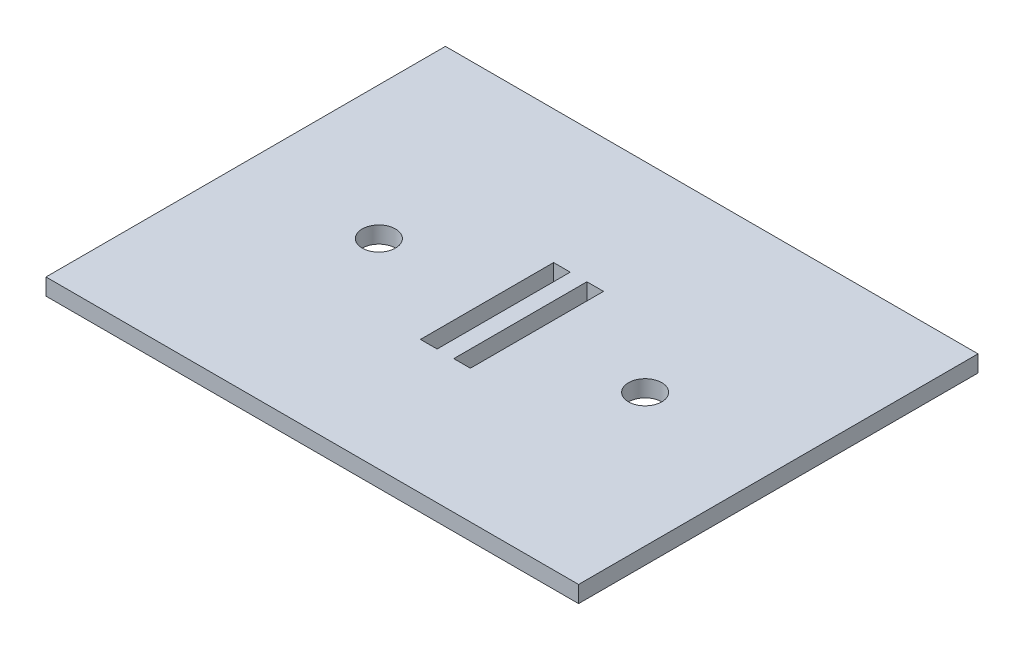
ISO-10303-21;
HEADER;
FILE_DESCRIPTION(('STEP AP214'),'2;1');
FILE_NAME('part.step','',(''),(''),'','','');
FILE_SCHEMA(('AUTOMOTIVE_DESIGN { 1 0 10303 214 1 1 1 1 }'));
ENDSEC;
DATA;
#1=APPLICATION_CONTEXT('core data for automotive mechanical design processes');
#2=APPLICATION_PROTOCOL_DEFINITION('international standard','automotive_design',2000,#1);
#3=PRODUCT_CONTEXT('',#1,'mechanical');
#4=PRODUCT('Part','Part','',(#3));
#5=PRODUCT_RELATED_PRODUCT_CATEGORY('part','',(#4));
#6=PRODUCT_DEFINITION_FORMATION('','',#4);
#7=PRODUCT_DEFINITION_CONTEXT('part definition',#1,'design');
#8=PRODUCT_DEFINITION('design','',#6,#7);
#9=PRODUCT_DEFINITION_SHAPE('','',#8);
#10=(LENGTH_UNIT() NAMED_UNIT(*) SI_UNIT(.MILLI.,.METRE.));
#11=(NAMED_UNIT(*) PLANE_ANGLE_UNIT() SI_UNIT($,.RADIAN.));
#12=(NAMED_UNIT(*) SI_UNIT($,.STERADIAN.) SOLID_ANGLE_UNIT());
#13=UNCERTAINTY_MEASURE_WITH_UNIT(LENGTH_MEASURE(1.E-05),#10,'distance_accuracy_value','');
#14=(GEOMETRIC_REPRESENTATION_CONTEXT(3) GLOBAL_UNCERTAINTY_ASSIGNED_CONTEXT((#13)) GLOBAL_UNIT_ASSIGNED_CONTEXT((#10,
#11,#12)) REPRESENTATION_CONTEXT('',''));
#15=CARTESIAN_POINT('',(0.,0.,0.));
#16=DIRECTION('',(0.,0.,1.));
#17=DIRECTION('',(1.,0.,0.));
#18=AXIS2_PLACEMENT_3D('',#15,#16,#17);
#19=CARTESIAN_POINT('',(-4.7625,3.175,0.));
#20=DIRECTION('',(1.,0.,0.));
#21=DIRECTION('',(0.,0.,-1.));
#22=AXIS2_PLACEMENT_3D('',#19,#20,#21);
#23=PLANE('',#22);
#24=DIRECTION('',(0.,0.,1.));
#25=VECTOR('',#24,1.);
#26=CARTESIAN_POINT('',(-4.7625,0.,0.));
#27=LINE('',#26,#25);
#28=CARTESIAN_POINT('',(-4.7625,0.,-12.7));
#29=VERTEX_POINT('',#28);
#30=CARTESIAN_POINT('',(-4.7625,0.,12.7));
#31=VERTEX_POINT('',#30);
#32=EDGE_CURVE('E211',#29,#31,#27,.T.);
#33=ORIENTED_EDGE('',*,*,#32,.F.);
#34=DIRECTION('',(0.,-1.,0.));
#35=VECTOR('',#34,1.);
#36=CARTESIAN_POINT('',(-4.7625,3.175,-12.7));
#37=LINE('',#36,#35);
#38=CARTESIAN_POINT('',(-4.7625,3.175,-12.7));
#39=VERTEX_POINT('',#38);
#40=EDGE_CURVE('E11',#39,#29,#37,.T.);
#41=ORIENTED_EDGE('',*,*,#40,.F.);
#42=DIRECTION('',(0.,0.,1.));
#43=VECTOR('',#42,1.);
#44=CARTESIAN_POINT('',(-4.7625,3.175,0.));
#45=LINE('',#44,#43);
#46=CARTESIAN_POINT('',(-4.7625,3.175,12.7));
#47=VERTEX_POINT('',#46);
#48=EDGE_CURVE('E161',#39,#47,#45,.T.);
#49=ORIENTED_EDGE('',*,*,#48,.T.);
#50=DIRECTION('',(0.,-1.,0.));
#51=VECTOR('',#50,1.);
#52=CARTESIAN_POINT('',(-4.7625,3.175,12.7));
#53=LINE('',#52,#51);
#54=EDGE_CURVE('E111',#47,#31,#53,.T.);
#55=ORIENTED_EDGE('',*,*,#54,.T.);
#56=EDGE_LOOP('',(#33,#41,#49,#55));
#57=FACE_BOUND('',#56,.T.);
#58=ADVANCED_FACE('F45',(#57),#23,.T.);
#59=CARTESIAN_POINT('',(0.,3.175,-12.7));
#60=DIRECTION('',(0.,0.,1.));
#61=DIRECTION('',(1.,0.,0.));
#62=AXIS2_PLACEMENT_3D('',#59,#60,#61);
#63=PLANE('',#62);
#64=DIRECTION('',(-1.,0.,0.));
#65=VECTOR('',#64,1.);
#66=CARTESIAN_POINT('',(0.,0.,-12.7));
#67=LINE('',#66,#65);
#68=CARTESIAN_POINT('',(-1.5875,0.,-12.7));
#69=VERTEX_POINT('',#68);
#70=EDGE_CURVE('E151',#69,#29,#67,.T.);
#71=ORIENTED_EDGE('',*,*,#70,.F.);
#72=DIRECTION('',(0.,-1.,0.));
#73=VECTOR('',#72,1.);
#74=CARTESIAN_POINT('',(-1.5875,3.175,-12.7));
#75=LINE('',#74,#73);
#76=CARTESIAN_POINT('',(-1.5875,3.175,-12.7));
#77=VERTEX_POINT('',#76);
#78=EDGE_CURVE('E56',#77,#69,#75,.T.);
#79=ORIENTED_EDGE('',*,*,#78,.F.);
#80=DIRECTION('',(-1.,0.,0.));
#81=VECTOR('',#80,1.);
#82=CARTESIAN_POINT('',(0.,3.175,-12.7));
#83=LINE('',#82,#81);
#84=EDGE_CURVE('E149',#77,#39,#83,.T.);
#85=ORIENTED_EDGE('',*,*,#84,.T.);
#86=ORIENTED_EDGE('',*,*,#40,.T.);
#87=EDGE_LOOP('',(#71,#79,#85,#86));
#88=FACE_BOUND('',#87,.T.);
#89=ADVANCED_FACE('F148',(#88),#63,.T.);
#90=CARTESIAN_POINT('',(-1.5875,3.175,0.));
#91=DIRECTION('',(-1.,0.,0.));
#92=DIRECTION('',(0.,0.,1.));
#93=AXIS2_PLACEMENT_3D('',#90,#91,#92);
#94=PLANE('',#93);
#95=DIRECTION('',(0.,0.,-1.));
#96=VECTOR('',#95,1.);
#97=CARTESIAN_POINT('',(-1.5875,0.,0.));
#98=LINE('',#97,#96);
#99=CARTESIAN_POINT('',(-1.5875,0.,12.7));
#100=VERTEX_POINT('',#99);
#101=EDGE_CURVE('E217',#100,#69,#98,.T.);
#102=ORIENTED_EDGE('',*,*,#101,.F.);
#103=DIRECTION('',(0.,-1.,0.));
#104=VECTOR('',#103,1.);
#105=CARTESIAN_POINT('',(-1.5875,3.175,12.7));
#106=LINE('',#105,#104);
#107=CARTESIAN_POINT('',(-1.5875,3.175,12.7));
#108=VERTEX_POINT('',#107);
#109=EDGE_CURVE('E104',#108,#100,#106,.T.);
#110=ORIENTED_EDGE('',*,*,#109,.F.);
#111=DIRECTION('',(0.,0.,-1.));
#112=VECTOR('',#111,1.);
#113=CARTESIAN_POINT('',(-1.5875,3.175,0.));
#114=LINE('',#113,#112);
#115=EDGE_CURVE('E160',#108,#77,#114,.T.);
#116=ORIENTED_EDGE('',*,*,#115,.T.);
#117=ORIENTED_EDGE('',*,*,#78,.T.);
#118=EDGE_LOOP('',(#102,#110,#116,#117));
#119=FACE_BOUND('',#118,.T.);
#120=ADVANCED_FACE('F164',(#119),#94,.T.);
#121=CARTESIAN_POINT('',(0.,3.175,38.1));
#122=DIRECTION('',(0.,0.,-1.));
#123=DIRECTION('',(-1.,0.,0.));
#124=AXIS2_PLACEMENT_3D('',#121,#122,#123);
#125=PLANE('',#124);
#126=DIRECTION('',(1.,0.,0.));
#127=VECTOR('',#126,1.);
#128=CARTESIAN_POINT('',(0.,0.,38.1));
#129=LINE('',#128,#127);
#130=CARTESIAN_POINT('',(-50.8,0.,38.1));
#131=VERTEX_POINT('',#130);
#132=CARTESIAN_POINT('',(50.8,0.,38.1));
#133=VERTEX_POINT('',#132);
#134=EDGE_CURVE('E195',#131,#133,#129,.T.);
#135=ORIENTED_EDGE('',*,*,#134,.T.);
#136=DIRECTION('',(0.,-1.,0.));
#137=VECTOR('',#136,1.);
#138=CARTESIAN_POINT('',(50.8,3.175,38.1));
#139=LINE('',#138,#137);
#140=CARTESIAN_POINT('',(50.8,3.175,38.1));
#141=VERTEX_POINT('',#140);
#142=EDGE_CURVE('E234',#141,#133,#139,.T.);
#143=ORIENTED_EDGE('',*,*,#142,.F.);
#144=DIRECTION('',(1.,0.,0.));
#145=VECTOR('',#144,1.);
#146=CARTESIAN_POINT('',(0.,3.175,38.1));
#147=LINE('',#146,#145);
#148=CARTESIAN_POINT('',(-50.8,3.175,38.1));
#149=VERTEX_POINT('',#148);
#150=EDGE_CURVE('E279',#149,#141,#147,.T.);
#151=ORIENTED_EDGE('',*,*,#150,.F.);
#152=DIRECTION('',(0.,-1.,0.));
#153=VECTOR('',#152,1.);
#154=CARTESIAN_POINT('',(-50.8,3.175,38.1));
#155=LINE('',#154,#153);
#156=EDGE_CURVE('E237',#149,#131,#155,.T.);
#157=ORIENTED_EDGE('',*,*,#156,.T.);
#158=EDGE_LOOP('',(#135,#143,#151,#157));
#159=FACE_BOUND('',#158,.T.);
#160=ADVANCED_FACE('F332',(#159),#125,.F.);
#161=CARTESIAN_POINT('',(50.8,3.175,0.));
#162=DIRECTION('',(-1.,0.,0.));
#163=DIRECTION('',(0.,0.,1.));
#164=AXIS2_PLACEMENT_3D('',#161,#162,#163);
#165=PLANE('',#164);
#166=DIRECTION('',(0.,0.,-1.));
#167=VECTOR('',#166,1.);
#168=CARTESIAN_POINT('',(50.8,0.,0.));
#169=LINE('',#168,#167);
#170=CARTESIAN_POINT('',(50.8,0.,-38.1));
#171=VERTEX_POINT('',#170);
#172=EDGE_CURVE('E199',#133,#171,#169,.T.);
#173=ORIENTED_EDGE('',*,*,#172,.T.);
#174=DIRECTION('',(0.,-1.,0.));
#175=VECTOR('',#174,1.);
#176=CARTESIAN_POINT('',(50.8,3.175,-38.1));
#177=LINE('',#176,#175);
#178=CARTESIAN_POINT('',(50.8,3.175,-38.1));
#179=VERTEX_POINT('',#178);
#180=EDGE_CURVE('E243',#179,#171,#177,.T.);
#181=ORIENTED_EDGE('',*,*,#180,.F.);
#182=DIRECTION('',(0.,0.,-1.));
#183=VECTOR('',#182,1.);
#184=CARTESIAN_POINT('',(50.8,3.175,0.));
#185=LINE('',#184,#183);
#186=EDGE_CURVE('E291',#141,#179,#185,.T.);
#187=ORIENTED_EDGE('',*,*,#186,.F.);
#188=ORIENTED_EDGE('',*,*,#142,.T.);
#189=EDGE_LOOP('',(#173,#181,#187,#188));
#190=FACE_BOUND('',#189,.T.);
#191=ADVANCED_FACE('F328',(#190),#165,.F.);
#192=CARTESIAN_POINT('',(0.,3.175,-38.1));
#193=DIRECTION('',(0.,0.,-1.));
#194=DIRECTION('',(-1.,0.,0.));
#195=AXIS2_PLACEMENT_3D('',#192,#193,#194);
#196=PLANE('',#195);
#197=DIRECTION('',(1.,0.,0.));
#198=VECTOR('',#197,1.);
#199=CARTESIAN_POINT('',(0.,0.,-38.1));
#200=LINE('',#199,#198);
#201=CARTESIAN_POINT('',(-50.8,0.,-38.1));
#202=VERTEX_POINT('',#201);
#203=EDGE_CURVE('E203',#202,#171,#200,.T.);
#204=ORIENTED_EDGE('',*,*,#203,.F.);
#205=DIRECTION('',(0.,-1.,0.));
#206=VECTOR('',#205,1.);
#207=CARTESIAN_POINT('',(-50.8,3.175,-38.1));
#208=LINE('',#207,#206);
#209=CARTESIAN_POINT('',(-50.8,3.175,-38.1));
#210=VERTEX_POINT('',#209);
#211=EDGE_CURVE('E240',#210,#202,#208,.T.);
#212=ORIENTED_EDGE('',*,*,#211,.F.);
#213=DIRECTION('',(1.,0.,0.));
#214=VECTOR('',#213,1.);
#215=CARTESIAN_POINT('',(0.,3.175,-38.1));
#216=LINE('',#215,#214);
#217=EDGE_CURVE('E294',#210,#179,#216,.T.);
#218=ORIENTED_EDGE('',*,*,#217,.T.);
#219=ORIENTED_EDGE('',*,*,#180,.T.);
#220=EDGE_LOOP('',(#204,#212,#218,#219));
#221=FACE_BOUND('',#220,.T.);
#222=ADVANCED_FACE('F325',(#221),#196,.T.);
#223=CARTESIAN_POINT('',(0.,3.175,-12.7));
#224=DIRECTION('',(0.,0.,-1.));
#225=DIRECTION('',(-1.,0.,0.));
#226=AXIS2_PLACEMENT_3D('',#223,#224,#225);
#227=PLANE('',#226);
#228=DIRECTION('',(1.,0.,0.));
#229=VECTOR('',#228,1.);
#230=CARTESIAN_POINT('',(0.,0.,-12.7));
#231=LINE('',#230,#229);
#232=CARTESIAN_POINT('',(1.5875,0.,-12.7));
#233=VERTEX_POINT('',#232);
#234=CARTESIAN_POINT('',(4.7625,0.,-12.7));
#235=VERTEX_POINT('',#234);
#236=EDGE_CURVE('E180',#233,#235,#231,.T.);
#237=ORIENTED_EDGE('',*,*,#236,.T.);
#238=DIRECTION('',(0.,-1.,0.));
#239=VECTOR('',#238,1.);
#240=CARTESIAN_POINT('',(4.7625,3.175,-12.7));
#241=LINE('',#240,#239);
#242=CARTESIAN_POINT('',(4.7625,3.175,-12.7));
#243=VERTEX_POINT('',#242);
#244=EDGE_CURVE('E49',#243,#235,#241,.T.);
#245=ORIENTED_EDGE('',*,*,#244,.F.);
#246=DIRECTION('',(1.,0.,0.));
#247=VECTOR('',#246,1.);
#248=CARTESIAN_POINT('',(0.,3.175,-12.7));
#249=LINE('',#248,#247);
#250=CARTESIAN_POINT('',(1.5875,3.175,-12.7));
#251=VERTEX_POINT('',#250);
#252=EDGE_CURVE('E231',#251,#243,#249,.T.);
#253=ORIENTED_EDGE('',*,*,#252,.F.);
#254=DIRECTION('',(0.,-1.,0.));
#255=VECTOR('',#254,1.);
#256=CARTESIAN_POINT('',(1.5875,3.175,-12.7));
#257=LINE('',#256,#255);
#258=EDGE_CURVE('E179',#251,#233,#257,.T.);
#259=ORIENTED_EDGE('',*,*,#258,.T.);
#260=EDGE_LOOP('',(#237,#245,#253,#259));
#261=FACE_BOUND('',#260,.T.);
#262=ADVANCED_FACE('F47',(#261),#227,.F.);
#263=CARTESIAN_POINT('',(4.7625,3.175,0.));
#264=DIRECTION('',(1.,0.,0.));
#265=DIRECTION('',(0.,0.,-1.));
#266=AXIS2_PLACEMENT_3D('',#263,#264,#265);
#267=PLANE('',#266);
#268=DIRECTION('',(0.,0.,1.));
#269=VECTOR('',#268,1.);
#270=CARTESIAN_POINT('',(4.7625,0.,0.));
#271=LINE('',#270,#269);
#272=CARTESIAN_POINT('',(4.7625,0.,12.7));
#273=VERTEX_POINT('',#272);
#274=EDGE_CURVE('E184',#235,#273,#271,.T.);
#275=ORIENTED_EDGE('',*,*,#274,.T.);
#276=DIRECTION('',(0.,-1.,0.));
#277=VECTOR('',#276,1.);
#278=CARTESIAN_POINT('',(4.7625,3.175,12.7));
#279=LINE('',#278,#277);
#280=CARTESIAN_POINT('',(4.7625,3.175,12.7));
#281=VERTEX_POINT('',#280);
#282=EDGE_CURVE('E254',#281,#273,#279,.T.);
#283=ORIENTED_EDGE('',*,*,#282,.F.);
#284=DIRECTION('',(0.,0.,1.));
#285=VECTOR('',#284,1.);
#286=CARTESIAN_POINT('',(4.7625,3.175,0.));
#287=LINE('',#286,#285);
#288=EDGE_CURVE('E119',#243,#281,#287,.T.);
#289=ORIENTED_EDGE('',*,*,#288,.F.);
#290=ORIENTED_EDGE('',*,*,#244,.T.);
#291=EDGE_LOOP('',(#275,#283,#289,#290));
#292=FACE_BOUND('',#291,.T.);
#293=ADVANCED_FACE('F261',(#292),#267,.F.);
#294=CARTESIAN_POINT('',(0.,3.175,12.7));
#295=DIRECTION('',(0.,0.,-1.));
#296=DIRECTION('',(-1.,0.,0.));
#297=AXIS2_PLACEMENT_3D('',#294,#295,#296);
#298=PLANE('',#297);
#299=DIRECTION('',(1.,0.,0.));
#300=VECTOR('',#299,1.);
#301=CARTESIAN_POINT('',(0.,0.,12.7));
#302=LINE('',#301,#300);
#303=CARTESIAN_POINT('',(1.5875,0.,12.7));
#304=VERTEX_POINT('',#303);
#305=EDGE_CURVE('E188',#304,#273,#302,.T.);
#306=ORIENTED_EDGE('',*,*,#305,.F.);
#307=DIRECTION('',(0.,-1.,0.));
#308=VECTOR('',#307,1.);
#309=CARTESIAN_POINT('',(1.5875,3.175,12.7));
#310=LINE('',#309,#308);
#311=CARTESIAN_POINT('',(1.5875,3.175,12.7));
#312=VERTEX_POINT('',#311);
#313=EDGE_CURVE('E252',#312,#304,#310,.T.);
#314=ORIENTED_EDGE('',*,*,#313,.F.);
#315=DIRECTION('',(1.,0.,0.));
#316=VECTOR('',#315,1.);
#317=CARTESIAN_POINT('',(0.,3.175,12.7));
#318=LINE('',#317,#316);
#319=EDGE_CURVE('E273',#312,#281,#318,.T.);
#320=ORIENTED_EDGE('',*,*,#319,.T.);
#321=ORIENTED_EDGE('',*,*,#282,.T.);
#322=EDGE_LOOP('',(#306,#314,#320,#321));
#323=FACE_BOUND('',#322,.T.);
#324=ADVANCED_FACE('F270',(#323),#298,.T.);
#325=CARTESIAN_POINT('',(25.4,3.175,0.));
#326=DIRECTION('',(0.,-1.,0.));
#327=DIRECTION('',(0.,0.,-1.));
#328=AXIS2_PLACEMENT_3D('',#325,#326,#327);
#329=CYLINDRICAL_SURFACE('',#328,3.175);
#330=CARTESIAN_POINT('',(25.4,3.175,0.));
#331=DIRECTION('',(0.,1.,0.));
#332=DIRECTION('',(0.,0.,1.));
#333=AXIS2_PLACEMENT_3D('',#330,#331,#332);
#334=CIRCLE('',#333,3.175);
#335=CARTESIAN_POINT('',(25.4,3.175,3.175));
#336=VERTEX_POINT('',#335);
#337=EDGE_CURVE('E168',#336,#336,#334,.T.);
#338=ORIENTED_EDGE('',*,*,#337,.T.);
#339=EDGE_LOOP('',(#338));
#340=FACE_BOUND('',#339,.T.);
#341=CARTESIAN_POINT('',(25.4,0.,0.));
#342=DIRECTION('',(0.,1.,0.));
#343=DIRECTION('',(0.,0.,1.));
#344=AXIS2_PLACEMENT_3D('',#341,#342,#343);
#345=CIRCLE('',#344,3.175);
#346=CARTESIAN_POINT('',(25.4,0.,3.175));
#347=VERTEX_POINT('',#346);
#348=EDGE_CURVE('E223',#347,#347,#345,.T.);
#349=ORIENTED_EDGE('',*,*,#348,.F.);
#350=EDGE_LOOP('',(#349));
#351=FACE_BOUND('',#350,.T.);
#352=ADVANCED_FACE('F307',(#340,#351),#329,.F.);
#353=CARTESIAN_POINT('',(0.,3.175,12.7));
#354=DIRECTION('',(0.,0.,1.));
#355=DIRECTION('',(1.,0.,0.));
#356=AXIS2_PLACEMENT_3D('',#353,#354,#355);
#357=PLANE('',#356);
#358=DIRECTION('',(-1.,0.,0.));
#359=VECTOR('',#358,1.);
#360=CARTESIAN_POINT('',(0.,0.,12.7));
#361=LINE('',#360,#359);
#362=EDGE_CURVE('E220',#100,#31,#361,.T.);
#363=ORIENTED_EDGE('',*,*,#362,.T.);
#364=ORIENTED_EDGE('',*,*,#54,.F.);
#365=DIRECTION('',(-1.,0.,0.));
#366=VECTOR('',#365,1.);
#367=CARTESIAN_POINT('',(0.,3.175,12.7));
#368=LINE('',#367,#366);
#369=EDGE_CURVE('E65',#108,#47,#368,.T.);
#370=ORIENTED_EDGE('',*,*,#369,.F.);
#371=ORIENTED_EDGE('',*,*,#109,.T.);
#372=EDGE_LOOP('',(#363,#364,#370,#371));
#373=FACE_BOUND('',#372,.T.);
#374=ADVANCED_FACE('F304',(#373),#357,.F.);
#375=CARTESIAN_POINT('',(-50.8,3.175,0.));
#376=DIRECTION('',(-1.,0.,0.));
#377=DIRECTION('',(0.,0.,1.));
#378=AXIS2_PLACEMENT_3D('',#375,#376,#377);
#379=PLANE('',#378);
#380=DIRECTION('',(0.,0.,-1.));
#381=VECTOR('',#380,1.);
#382=CARTESIAN_POINT('',(-50.8,0.,0.));
#383=LINE('',#382,#381);
#384=EDGE_CURVE('E207',#131,#202,#383,.T.);
#385=ORIENTED_EDGE('',*,*,#384,.F.);
#386=ORIENTED_EDGE('',*,*,#156,.F.);
#387=DIRECTION('',(0.,0.,-1.));
#388=VECTOR('',#387,1.);
#389=CARTESIAN_POINT('',(-50.8,3.175,0.));
#390=LINE('',#389,#388);
#391=EDGE_CURVE('E298',#149,#210,#390,.T.);
#392=ORIENTED_EDGE('',*,*,#391,.T.);
#393=ORIENTED_EDGE('',*,*,#211,.T.);
#394=EDGE_LOOP('',(#385,#386,#392,#393));
#395=FACE_BOUND('',#394,.T.);
#396=ADVANCED_FACE('F306',(#395),#379,.T.);
#397=CARTESIAN_POINT('',(1.5875,3.175,0.));
#398=DIRECTION('',(-1.,0.,0.));
#399=DIRECTION('',(0.,0.,1.));
#400=AXIS2_PLACEMENT_3D('',#397,#398,#399);
#401=PLANE('',#400);
#402=DIRECTION('',(0.,0.,-1.));
#403=VECTOR('',#402,1.);
#404=CARTESIAN_POINT('',(1.5875,0.,0.));
#405=LINE('',#404,#403);
#406=EDGE_CURVE('E192',#304,#233,#405,.T.);
#407=ORIENTED_EDGE('',*,*,#406,.T.);
#408=ORIENTED_EDGE('',*,*,#258,.F.);
#409=DIRECTION('',(0.,0.,-1.));
#410=VECTOR('',#409,1.);
#411=CARTESIAN_POINT('',(1.5875,3.175,0.));
#412=LINE('',#411,#410);
#413=EDGE_CURVE('E275',#312,#251,#412,.T.);
#414=ORIENTED_EDGE('',*,*,#413,.F.);
#415=ORIENTED_EDGE('',*,*,#313,.T.);
#416=EDGE_LOOP('',(#407,#408,#414,#415));
#417=FACE_BOUND('',#416,.T.);
#418=ADVANCED_FACE('F276',(#417),#401,.F.);
#419=CARTESIAN_POINT('',(-25.4,3.175,0.));
#420=DIRECTION('',(0.,-1.,0.));
#421=DIRECTION('',(0.,0.,-1.));
#422=AXIS2_PLACEMENT_3D('',#419,#420,#421);
#423=CYLINDRICAL_SURFACE('',#422,3.175);
#424=CARTESIAN_POINT('',(-25.4,3.175,0.));
#425=DIRECTION('',(0.,1.,0.));
#426=DIRECTION('',(0.,0.,1.));
#427=AXIS2_PLACEMENT_3D('',#424,#425,#426);
#428=CIRCLE('',#427,3.175);
#429=CARTESIAN_POINT('',(-25.4,3.175,3.175));
#430=VERTEX_POINT('',#429);
#431=EDGE_CURVE('E175',#430,#430,#428,.F.);
#432=ORIENTED_EDGE('',*,*,#431,.F.);
#433=EDGE_LOOP('',(#432));
#434=FACE_BOUND('',#433,.T.);
#435=CARTESIAN_POINT('',(-25.4,0.,0.));
#436=DIRECTION('',(0.,1.,0.));
#437=DIRECTION('',(0.,0.,1.));
#438=AXIS2_PLACEMENT_3D('',#435,#436,#437);
#439=CIRCLE('',#438,3.175);
#440=CARTESIAN_POINT('',(-25.4,0.,3.175));
#441=VERTEX_POINT('',#440);
#442=EDGE_CURVE('E227',#441,#441,#439,.F.);
#443=ORIENTED_EDGE('',*,*,#442,.T.);
#444=EDGE_LOOP('',(#443));
#445=FACE_BOUND('',#444,.T.);
#446=ADVANCED_FACE('F339',(#434,#445),#423,.F.);
#447=CARTESIAN_POINT('',(0.,3.175,0.));
#448=DIRECTION('',(0.,1.,0.));
#449=DIRECTION('',(0.,0.,1.));
#450=AXIS2_PLACEMENT_3D('',#447,#448,#449);
#451=PLANE('',#450);
#452=ORIENTED_EDGE('',*,*,#252,.T.);
#453=ORIENTED_EDGE('',*,*,#288,.T.);
#454=ORIENTED_EDGE('',*,*,#319,.F.);
#455=ORIENTED_EDGE('',*,*,#413,.T.);
#456=EDGE_LOOP('',(#452,#453,#454,#455));
#457=FACE_BOUND('',#456,.T.);
#458=ORIENTED_EDGE('',*,*,#150,.T.);
#459=ORIENTED_EDGE('',*,*,#186,.T.);
#460=ORIENTED_EDGE('',*,*,#217,.F.);
#461=ORIENTED_EDGE('',*,*,#391,.F.);
#462=EDGE_LOOP('',(#458,#459,#460,#461));
#463=FACE_BOUND('',#462,.T.);
#464=ORIENTED_EDGE('',*,*,#48,.F.);
#465=ORIENTED_EDGE('',*,*,#84,.F.);
#466=ORIENTED_EDGE('',*,*,#115,.F.);
#467=ORIENTED_EDGE('',*,*,#369,.T.);
#468=EDGE_LOOP('',(#464,#465,#466,#467));
#469=FACE_BOUND('',#468,.T.);
#470=ORIENTED_EDGE('',*,*,#337,.F.);
#471=EDGE_LOOP('',(#470));
#472=FACE_BOUND('',#471,.T.);
#473=ORIENTED_EDGE('',*,*,#431,.T.);
#474=EDGE_LOOP('',(#473));
#475=FACE_BOUND('',#474,.T.);
#476=ADVANCED_FACE('F158',(#457,#463,#469,#472,#475),#451,.T.);
#477=CARTESIAN_POINT('',(0.,0.,0.));
#478=DIRECTION('',(0.,1.,0.));
#479=DIRECTION('',(0.,0.,1.));
#480=AXIS2_PLACEMENT_3D('',#477,#478,#479);
#481=PLANE('',#480);
#482=ORIENTED_EDGE('',*,*,#236,.F.);
#483=ORIENTED_EDGE('',*,*,#406,.F.);
#484=ORIENTED_EDGE('',*,*,#305,.T.);
#485=ORIENTED_EDGE('',*,*,#274,.F.);
#486=EDGE_LOOP('',(#482,#483,#484,#485));
#487=FACE_BOUND('',#486,.T.);
#488=ORIENTED_EDGE('',*,*,#134,.F.);
#489=ORIENTED_EDGE('',*,*,#384,.T.);
#490=ORIENTED_EDGE('',*,*,#203,.T.);
#491=ORIENTED_EDGE('',*,*,#172,.F.);
#492=EDGE_LOOP('',(#488,#489,#490,#491));
#493=FACE_BOUND('',#492,.T.);
#494=ORIENTED_EDGE('',*,*,#32,.T.);
#495=ORIENTED_EDGE('',*,*,#362,.F.);
#496=ORIENTED_EDGE('',*,*,#101,.T.);
#497=ORIENTED_EDGE('',*,*,#70,.T.);
#498=EDGE_LOOP('',(#494,#495,#496,#497));
#499=FACE_BOUND('',#498,.T.);
#500=ORIENTED_EDGE('',*,*,#348,.T.);
#501=EDGE_LOOP('',(#500));
#502=FACE_BOUND('',#501,.T.);
#503=ORIENTED_EDGE('',*,*,#442,.F.);
#504=EDGE_LOOP('',(#503));
#505=FACE_BOUND('',#504,.T.);
#506=ADVANCED_FACE('F268',(#487,#493,#499,#502,#505),#481,.F.);
#507=CLOSED_SHELL('',(#58,#89,#120,#160,#191,#222,#262,#293,#324,#352,#374,#396,#418,#446,#476,#506));
#508=MANIFOLD_SOLID_BREP('B2',#507);
#509=ADVANCED_BREP_SHAPE_REPRESENTATION('',(#18,#508),#14);
#510=SHAPE_DEFINITION_REPRESENTATION(#9,#509);
ENDSEC;
END-ISO-10303-21;
